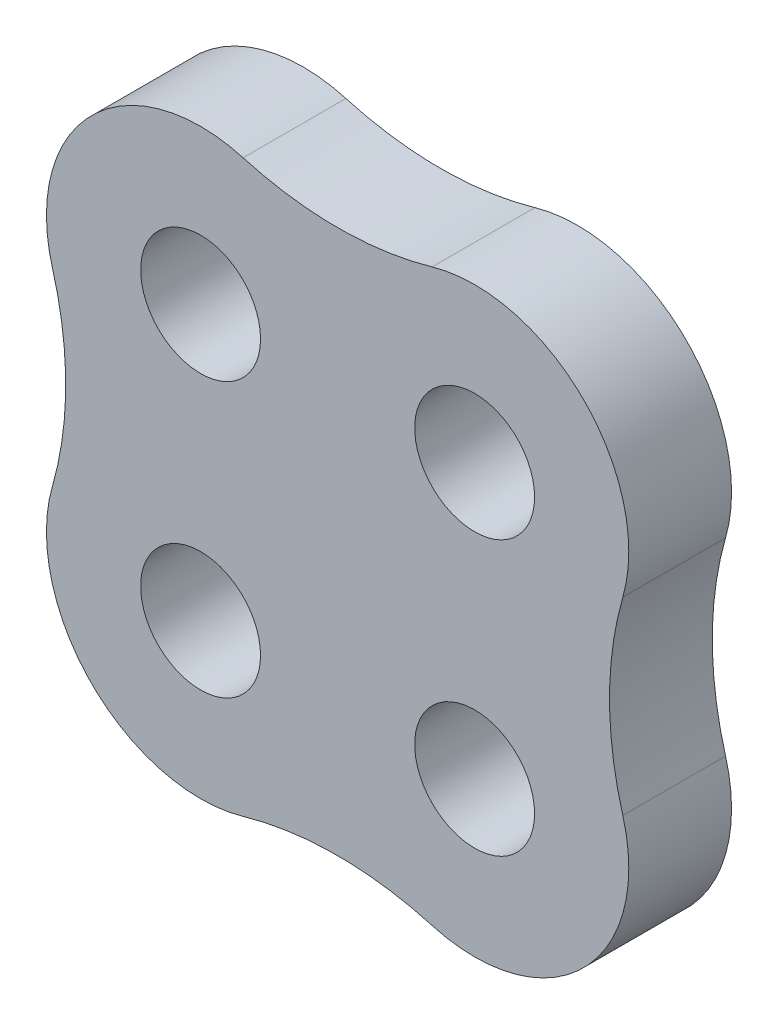
ISO-10303-21;
HEADER;
FILE_DESCRIPTION(('STEP AP214'),'2;1');
FILE_NAME('part.step','',(''),(''),'','','');
FILE_SCHEMA(('AUTOMOTIVE_DESIGN { 1 0 10303 214 1 1 1 1 }'));
ENDSEC;
DATA;
#1=APPLICATION_CONTEXT('core data for automotive mechanical design processes');
#2=APPLICATION_PROTOCOL_DEFINITION('international standard','automotive_design',2000,#1);
#3=PRODUCT_CONTEXT('',#1,'mechanical');
#4=PRODUCT('Part','Part','',(#3));
#5=PRODUCT_RELATED_PRODUCT_CATEGORY('part','',(#4));
#6=PRODUCT_DEFINITION_FORMATION('','',#4);
#7=PRODUCT_DEFINITION_CONTEXT('part definition',#1,'design');
#8=PRODUCT_DEFINITION('design','',#6,#7);
#9=PRODUCT_DEFINITION_SHAPE('','',#8);
#10=(LENGTH_UNIT() NAMED_UNIT(*) SI_UNIT(.MILLI.,.METRE.));
#11=(NAMED_UNIT(*) PLANE_ANGLE_UNIT() SI_UNIT($,.RADIAN.));
#12=(NAMED_UNIT(*) SI_UNIT($,.STERADIAN.) SOLID_ANGLE_UNIT());
#13=UNCERTAINTY_MEASURE_WITH_UNIT(LENGTH_MEASURE(1.E-05),#10,'distance_accuracy_value','');
#14=(GEOMETRIC_REPRESENTATION_CONTEXT(3) GLOBAL_UNCERTAINTY_ASSIGNED_CONTEXT((#13)) GLOBAL_UNIT_ASSIGNED_CONTEXT((#10,
#11,#12)) REPRESENTATION_CONTEXT('',''));
#15=CARTESIAN_POINT('',(0.,0.,0.));
#16=DIRECTION('',(0.,0.,1.));
#17=DIRECTION('',(1.,0.,0.));
#18=AXIS2_PLACEMENT_3D('',#15,#16,#17);
#19=CARTESIAN_POINT('',(7.99999999999997,8.,3.));
#20=DIRECTION('',(0.,0.,-1.));
#21=DIRECTION('',(-1.,0.,0.));
#22=AXIS2_PLACEMENT_3D('',#19,#20,#21);
#23=CYLINDRICAL_SURFACE('',#22,4.5);
#24=CARTESIAN_POINT('',(7.99999999999997,8.,3.));
#25=DIRECTION('',(0.,0.,1.));
#26=DIRECTION('',(1.,0.,0.));
#27=AXIS2_PLACEMENT_3D('',#24,#25,#26);
#28=CIRCLE('',#27,4.5);
#29=CARTESIAN_POINT('',(12.3253875442378,6.75862068965519,3.));
#30=VERTEX_POINT('',#29);
#31=CARTESIAN_POINT('',(6.75862068965514,12.3253875442378,3.));
#32=VERTEX_POINT('',#31);
#33=EDGE_CURVE('E122',#30,#32,#28,.T.);
#34=ORIENTED_EDGE('',*,*,#33,.F.);
#35=DIRECTION('',(0.,0.,-1.));
#36=VECTOR('',#35,1.);
#37=CARTESIAN_POINT('',(12.3253875442378,6.75862068965519,3.));
#38=LINE('',#37,#36);
#39=CARTESIAN_POINT('',(12.3253875442378,6.75862068965519,0.));
#40=VERTEX_POINT('',#39);
#41=EDGE_CURVE('E107',#30,#40,#38,.T.);
#42=ORIENTED_EDGE('',*,*,#41,.T.);
#43=CARTESIAN_POINT('',(7.99999999999997,8.,0.));
#44=DIRECTION('',(0.,0.,1.));
#45=DIRECTION('',(1.,0.,0.));
#46=AXIS2_PLACEMENT_3D('',#43,#44,#45);
#47=CIRCLE('',#46,4.5);
#48=CARTESIAN_POINT('',(6.75862068965514,12.3253875442378,0.));
#49=VERTEX_POINT('',#48);
#50=EDGE_CURVE('E119',#40,#49,#47,.T.);
#51=ORIENTED_EDGE('',*,*,#50,.T.);
#52=DIRECTION('',(0.,0.,-1.));
#53=VECTOR('',#52,1.);
#54=CARTESIAN_POINT('',(6.75862068965514,12.3253875442378,3.));
#55=LINE('',#54,#53);
#56=EDGE_CURVE('E124',#49,#32,#55,.F.);
#57=ORIENTED_EDGE('',*,*,#56,.T.);
#58=EDGE_LOOP('',(#34,#42,#51,#57));
#59=FACE_BOUND('',#58,.T.);
#60=ADVANCED_FACE('F37',(#59),#23,.T.);
#61=CARTESIAN_POINT('',(0.,8.,3.));
#62=DIRECTION('',(0.,0.,-1.));
#63=DIRECTION('',(-1.,0.,0.));
#64=AXIS2_PLACEMENT_3D('',#61,#62,#63);
#65=CYLINDRICAL_SURFACE('',#64,4.5);
#66=CARTESIAN_POINT('',(0.,8.,3.));
#67=DIRECTION('',(0.,0.,1.));
#68=DIRECTION('',(1.,0.,0.));
#69=AXIS2_PLACEMENT_3D('',#66,#67,#68);
#70=CIRCLE('',#69,4.5);
#71=CARTESIAN_POINT('',(1.2413793103448,12.3253875442378,3.));
#72=VERTEX_POINT('',#71);
#73=CARTESIAN_POINT('',(-4.32538754423786,6.75862068965516,3.));
#74=VERTEX_POINT('',#73);
#75=EDGE_CURVE('E191',#72,#74,#70,.T.);
#76=ORIENTED_EDGE('',*,*,#75,.F.);
#77=DIRECTION('',(0.,0.,-1.));
#78=VECTOR('',#77,1.);
#79=CARTESIAN_POINT('',(1.2413793103448,12.3253875442378,3.));
#80=LINE('',#79,#78);
#81=CARTESIAN_POINT('',(1.2413793103448,12.3253875442378,0.));
#82=VERTEX_POINT('',#81);
#83=EDGE_CURVE('E160',#72,#82,#80,.T.);
#84=ORIENTED_EDGE('',*,*,#83,.T.);
#85=CARTESIAN_POINT('',(0.,8.,0.));
#86=DIRECTION('',(0.,0.,1.));
#87=DIRECTION('',(1.,0.,0.));
#88=AXIS2_PLACEMENT_3D('',#85,#86,#87);
#89=CIRCLE('',#88,4.5);
#90=CARTESIAN_POINT('',(-4.32538754423786,6.75862068965516,0.));
#91=VERTEX_POINT('',#90);
#92=EDGE_CURVE('E130',#82,#91,#89,.T.);
#93=ORIENTED_EDGE('',*,*,#92,.T.);
#94=DIRECTION('',(0.,0.,-1.));
#95=VECTOR('',#94,1.);
#96=CARTESIAN_POINT('',(-4.32538754423786,6.75862068965516,3.));
#97=LINE('',#96,#95);
#98=EDGE_CURVE('E158',#91,#74,#97,.F.);
#99=ORIENTED_EDGE('',*,*,#98,.T.);
#100=EDGE_LOOP('',(#76,#84,#93,#99));
#101=FACE_BOUND('',#100,.T.);
#102=ADVANCED_FACE('F215',(#101),#65,.T.);
#103=CARTESIAN_POINT('',(0.,0.,3.));
#104=DIRECTION('',(0.,0.,-1.));
#105=DIRECTION('',(-1.,0.,0.));
#106=AXIS2_PLACEMENT_3D('',#103,#104,#105);
#107=CYLINDRICAL_SURFACE('',#106,4.5);
#108=CARTESIAN_POINT('',(0.,0.,3.));
#109=DIRECTION('',(0.,0.,1.));
#110=DIRECTION('',(1.,0.,0.));
#111=AXIS2_PLACEMENT_3D('',#108,#109,#110);
#112=CIRCLE('',#111,4.5);
#113=CARTESIAN_POINT('',(-4.32538754423784,1.24137931034481,3.));
#114=VERTEX_POINT('',#113);
#115=CARTESIAN_POINT('',(1.24137931034483,-4.32538754423783,3.));
#116=VERTEX_POINT('',#115);
#117=EDGE_CURVE('E183',#114,#116,#112,.T.);
#118=ORIENTED_EDGE('',*,*,#117,.F.);
#119=DIRECTION('',(0.,0.,-1.));
#120=VECTOR('',#119,1.);
#121=CARTESIAN_POINT('',(-4.32538754423784,1.24137931034481,3.));
#122=LINE('',#121,#120);
#123=CARTESIAN_POINT('',(-4.32538754423784,1.24137931034481,0.));
#124=VERTEX_POINT('',#123);
#125=EDGE_CURVE('E114',#114,#124,#122,.T.);
#126=ORIENTED_EDGE('',*,*,#125,.T.);
#127=CARTESIAN_POINT('',(0.,0.,0.));
#128=DIRECTION('',(0.,0.,1.));
#129=DIRECTION('',(1.,0.,0.));
#130=AXIS2_PLACEMENT_3D('',#127,#128,#129);
#131=CIRCLE('',#130,4.5);
#132=CARTESIAN_POINT('',(1.24137931034483,-4.32538754423783,0.));
#133=VERTEX_POINT('',#132);
#134=EDGE_CURVE('E133',#124,#133,#131,.T.);
#135=ORIENTED_EDGE('',*,*,#134,.T.);
#136=DIRECTION('',(0.,0.,-1.));
#137=VECTOR('',#136,1.);
#138=CARTESIAN_POINT('',(1.24137931034483,-4.32538754423783,3.));
#139=LINE('',#138,#137);
#140=EDGE_CURVE('E52',#133,#116,#139,.F.);
#141=ORIENTED_EDGE('',*,*,#140,.T.);
#142=EDGE_LOOP('',(#118,#126,#135,#141));
#143=FACE_BOUND('',#142,.T.);
#144=ADVANCED_FACE('F175',(#143),#107,.T.);
#145=CARTESIAN_POINT('',(0.,8.,3.));
#146=DIRECTION('',(0.,0.,-1.));
#147=DIRECTION('',(-1.,0.,0.));
#148=AXIS2_PLACEMENT_3D('',#145,#146,#147);
#149=CYLINDRICAL_SURFACE('',#148,1.75);
#150=CARTESIAN_POINT('',(0.,8.,3.));
#151=DIRECTION('',(0.,0.,1.));
#152=DIRECTION('',(1.,0.,0.));
#153=AXIS2_PLACEMENT_3D('',#150,#151,#152);
#154=CIRCLE('',#153,1.75);
#155=CARTESIAN_POINT('',(1.74999999999997,8.,3.));
#156=VERTEX_POINT('',#155);
#157=EDGE_CURVE('E196',#156,#156,#154,.T.);
#158=ORIENTED_EDGE('',*,*,#157,.T.);
#159=EDGE_LOOP('',(#158));
#160=FACE_BOUND('',#159,.T.);
#161=CARTESIAN_POINT('',(0.,8.,0.));
#162=DIRECTION('',(0.,0.,1.));
#163=DIRECTION('',(1.,0.,0.));
#164=AXIS2_PLACEMENT_3D('',#161,#162,#163);
#165=CIRCLE('',#164,1.75);
#166=CARTESIAN_POINT('',(1.74999999999997,8.,0.));
#167=VERTEX_POINT('',#166);
#168=EDGE_CURVE('E148',#167,#167,#165,.T.);
#169=ORIENTED_EDGE('',*,*,#168,.F.);
#170=EDGE_LOOP('',(#169));
#171=FACE_BOUND('',#170,.T.);
#172=ADVANCED_FACE('F293',(#160,#171),#149,.F.);
#173=CARTESIAN_POINT('',(0.,0.,3.));
#174=DIRECTION('',(0.,0.,-1.));
#175=DIRECTION('',(-1.,0.,0.));
#176=AXIS2_PLACEMENT_3D('',#173,#174,#175);
#177=CYLINDRICAL_SURFACE('',#176,1.75);
#178=CARTESIAN_POINT('',(0.,0.,3.));
#179=DIRECTION('',(0.,0.,1.));
#180=DIRECTION('',(1.,0.,0.));
#181=AXIS2_PLACEMENT_3D('',#178,#179,#180);
#182=CIRCLE('',#181,1.75);
#183=CARTESIAN_POINT('',(1.75,0.,3.));
#184=VERTEX_POINT('',#183);
#185=EDGE_CURVE('E189',#184,#184,#182,.T.);
#186=ORIENTED_EDGE('',*,*,#185,.T.);
#187=EDGE_LOOP('',(#186));
#188=FACE_BOUND('',#187,.T.);
#189=CARTESIAN_POINT('',(0.,0.,0.));
#190=DIRECTION('',(0.,0.,1.));
#191=DIRECTION('',(1.,0.,0.));
#192=AXIS2_PLACEMENT_3D('',#189,#190,#191);
#193=CIRCLE('',#192,1.75);
#194=CARTESIAN_POINT('',(1.75,0.,0.));
#195=VERTEX_POINT('',#194);
#196=EDGE_CURVE('E145',#195,#195,#193,.T.);
#197=ORIENTED_EDGE('',*,*,#196,.F.);
#198=EDGE_LOOP('',(#197));
#199=FACE_BOUND('',#198,.T.);
#200=ADVANCED_FACE('F317',(#188,#199),#177,.F.);
#201=CARTESIAN_POINT('',(8.,0.,3.));
#202=DIRECTION('',(0.,0.,-1.));
#203=DIRECTION('',(-1.,0.,0.));
#204=AXIS2_PLACEMENT_3D('',#201,#202,#203);
#205=CYLINDRICAL_SURFACE('',#204,1.75);
#206=CARTESIAN_POINT('',(8.,0.,3.));
#207=DIRECTION('',(0.,0.,1.));
#208=DIRECTION('',(1.,0.,0.));
#209=AXIS2_PLACEMENT_3D('',#206,#207,#208);
#210=CIRCLE('',#209,1.75);
#211=CARTESIAN_POINT('',(9.75,0.,3.));
#212=VERTEX_POINT('',#211);
#213=EDGE_CURVE('E186',#212,#212,#210,.T.);
#214=ORIENTED_EDGE('',*,*,#213,.T.);
#215=EDGE_LOOP('',(#214));
#216=FACE_BOUND('',#215,.T.);
#217=CARTESIAN_POINT('',(8.,0.,0.));
#218=DIRECTION('',(0.,0.,1.));
#219=DIRECTION('',(1.,0.,0.));
#220=AXIS2_PLACEMENT_3D('',#217,#218,#219);
#221=CIRCLE('',#220,1.75);
#222=CARTESIAN_POINT('',(9.75,0.,0.));
#223=VERTEX_POINT('',#222);
#224=EDGE_CURVE('E142',#223,#223,#221,.T.);
#225=ORIENTED_EDGE('',*,*,#224,.F.);
#226=EDGE_LOOP('',(#225));
#227=FACE_BOUND('',#226,.T.);
#228=ADVANCED_FACE('F281',(#216,#227),#205,.F.);
#229=CARTESIAN_POINT('',(8.,0.,3.));
#230=DIRECTION('',(0.,0.,-1.));
#231=DIRECTION('',(-1.,0.,0.));
#232=AXIS2_PLACEMENT_3D('',#229,#230,#231);
#233=CYLINDRICAL_SURFACE('',#232,4.5);
#234=CARTESIAN_POINT('',(8.,0.,0.));
#235=DIRECTION('',(0.,0.,1.));
#236=DIRECTION('',(1.,0.,0.));
#237=AXIS2_PLACEMENT_3D('',#234,#235,#236);
#238=CIRCLE('',#237,4.5);
#239=CARTESIAN_POINT('',(6.75862068965517,-4.32538754423784,0.));
#240=VERTEX_POINT('',#239);
#241=CARTESIAN_POINT('',(12.3253875442378,1.24137931034484,0.));
#242=VERTEX_POINT('',#241);
#243=EDGE_CURVE('E140',#240,#242,#238,.T.);
#244=ORIENTED_EDGE('',*,*,#243,.T.);
#245=DIRECTION('',(0.,0.,-1.));
#246=VECTOR('',#245,1.);
#247=CARTESIAN_POINT('',(12.3253875442378,1.24137931034484,3.));
#248=LINE('',#247,#246);
#249=CARTESIAN_POINT('',(12.3253875442378,1.24137931034484,3.));
#250=VERTEX_POINT('',#249);
#251=EDGE_CURVE('E108',#242,#250,#248,.F.);
#252=ORIENTED_EDGE('',*,*,#251,.T.);
#253=CARTESIAN_POINT('',(8.,0.,3.));
#254=DIRECTION('',(0.,0.,1.));
#255=DIRECTION('',(1.,0.,0.));
#256=AXIS2_PLACEMENT_3D('',#253,#254,#255);
#257=CIRCLE('',#256,4.5);
#258=CARTESIAN_POINT('',(6.75862068965517,-4.32538754423784,3.));
#259=VERTEX_POINT('',#258);
#260=EDGE_CURVE('E182',#259,#250,#257,.T.);
#261=ORIENTED_EDGE('',*,*,#260,.F.);
#262=DIRECTION('',(0.,0.,-1.));
#263=VECTOR('',#262,1.);
#264=CARTESIAN_POINT('',(6.75862068965517,-4.32538754423783,3.));
#265=LINE('',#264,#263);
#266=EDGE_CURVE('E123',#259,#240,#265,.T.);
#267=ORIENTED_EDGE('',*,*,#266,.T.);
#268=EDGE_LOOP('',(#244,#252,#261,#267));
#269=FACE_BOUND('',#268,.T.);
#270=ADVANCED_FACE('F185',(#269),#233,.T.);
#271=CARTESIAN_POINT('',(7.99999999999997,8.,3.));
#272=DIRECTION('',(0.,0.,-1.));
#273=DIRECTION('',(-1.,0.,0.));
#274=AXIS2_PLACEMENT_3D('',#271,#272,#273);
#275=CYLINDRICAL_SURFACE('',#274,1.75);
#276=CARTESIAN_POINT('',(7.99999999999997,8.,3.));
#277=DIRECTION('',(0.,0.,1.));
#278=DIRECTION('',(1.,0.,0.));
#279=AXIS2_PLACEMENT_3D('',#276,#277,#278);
#280=CIRCLE('',#279,1.75);
#281=CARTESIAN_POINT('',(9.74999999999997,8.,3.));
#282=VERTEX_POINT('',#281);
#283=EDGE_CURVE('E136',#282,#282,#280,.T.);
#284=ORIENTED_EDGE('',*,*,#283,.T.);
#285=EDGE_LOOP('',(#284));
#286=FACE_BOUND('',#285,.T.);
#287=CARTESIAN_POINT('',(7.99999999999997,8.,0.));
#288=DIRECTION('',(0.,0.,1.));
#289=DIRECTION('',(1.,0.,0.));
#290=AXIS2_PLACEMENT_3D('',#287,#288,#289);
#291=CIRCLE('',#290,1.75);
#292=CARTESIAN_POINT('',(9.74999999999997,8.,0.));
#293=VERTEX_POINT('',#292);
#294=EDGE_CURVE('E151',#293,#293,#291,.T.);
#295=ORIENTED_EDGE('',*,*,#294,.F.);
#296=EDGE_LOOP('',(#295));
#297=FACE_BOUND('',#296,.T.);
#298=ADVANCED_FACE('F203',(#286,#297),#275,.F.);
#299=CARTESIAN_POINT('',(0.,0.,3.));
#300=DIRECTION('',(0.,0.,1.));
#301=DIRECTION('',(1.,0.,0.));
#302=AXIS2_PLACEMENT_3D('',#299,#300,#301);
#303=PLANE('',#302);
#304=ORIENTED_EDGE('',*,*,#260,.T.);
#305=CARTESIAN_POINT('',(21.9373598647663,4.00000000000005,3.));
#306=DIRECTION('',(0.,0.,1.));
#307=DIRECTION('',(1.,0.,0.));
#308=AXIS2_PLACEMENT_3D('',#305,#306,#307);
#309=CIRCLE('',#308,10.);
#310=EDGE_CURVE('E113',#250,#30,#309,.F.);
#311=ORIENTED_EDGE('',*,*,#310,.T.);
#312=ORIENTED_EDGE('',*,*,#33,.T.);
#313=CARTESIAN_POINT('',(3.99999999999997,21.9373598647664,3.));
#314=DIRECTION('',(0.,0.,1.));
#315=DIRECTION('',(1.,0.,0.));
#316=AXIS2_PLACEMENT_3D('',#313,#314,#315);
#317=CIRCLE('',#316,10.);
#318=EDGE_CURVE('E168',#32,#72,#317,.F.);
#319=ORIENTED_EDGE('',*,*,#318,.T.);
#320=ORIENTED_EDGE('',*,*,#75,.T.);
#321=CARTESIAN_POINT('',(-13.9373598647664,3.99999999999995,3.));
#322=DIRECTION('',(0.,0.,1.));
#323=DIRECTION('',(1.,0.,0.));
#324=AXIS2_PLACEMENT_3D('',#321,#322,#323);
#325=CIRCLE('',#324,10.);
#326=EDGE_CURVE('E59',#74,#114,#325,.F.);
#327=ORIENTED_EDGE('',*,*,#326,.T.);
#328=ORIENTED_EDGE('',*,*,#117,.T.);
#329=CARTESIAN_POINT('',(3.99999999999999,-13.9373598647664,3.));
#330=DIRECTION('',(0.,0.,1.));
#331=DIRECTION('',(1.,0.,0.));
#332=AXIS2_PLACEMENT_3D('',#329,#330,#331);
#333=CIRCLE('',#332,10.);
#334=EDGE_CURVE('E11',#116,#259,#333,.F.);
#335=ORIENTED_EDGE('',*,*,#334,.T.);
#336=EDGE_LOOP('',(#304,#311,#312,#319,#320,#327,#328,#335));
#337=FACE_BOUND('',#336,.T.);
#338=ORIENTED_EDGE('',*,*,#213,.F.);
#339=EDGE_LOOP('',(#338));
#340=FACE_BOUND('',#339,.T.);
#341=ORIENTED_EDGE('',*,*,#185,.F.);
#342=EDGE_LOOP('',(#341));
#343=FACE_BOUND('',#342,.T.);
#344=ORIENTED_EDGE('',*,*,#157,.F.);
#345=EDGE_LOOP('',(#344));
#346=FACE_BOUND('',#345,.T.);
#347=ORIENTED_EDGE('',*,*,#283,.F.);
#348=EDGE_LOOP('',(#347));
#349=FACE_BOUND('',#348,.T.);
#350=ADVANCED_FACE('F180',(#337,#340,#343,#346,#349),#303,.T.);
#351=CARTESIAN_POINT('',(0.,0.,0.));
#352=DIRECTION('',(0.,0.,1.));
#353=DIRECTION('',(1.,0.,0.));
#354=AXIS2_PLACEMENT_3D('',#351,#352,#353);
#355=PLANE('',#354);
#356=ORIENTED_EDGE('',*,*,#50,.F.);
#357=CARTESIAN_POINT('',(21.9373598647663,4.00000000000005,0.));
#358=DIRECTION('',(0.,0.,1.));
#359=DIRECTION('',(1.,0.,0.));
#360=AXIS2_PLACEMENT_3D('',#357,#358,#359);
#361=CIRCLE('',#360,10.);
#362=EDGE_CURVE('E103',#40,#242,#361,.T.);
#363=ORIENTED_EDGE('',*,*,#362,.T.);
#364=ORIENTED_EDGE('',*,*,#243,.F.);
#365=CARTESIAN_POINT('',(3.99999999999999,-13.9373598647664,0.));
#366=DIRECTION('',(0.,0.,1.));
#367=DIRECTION('',(1.,0.,0.));
#368=AXIS2_PLACEMENT_3D('',#365,#366,#367);
#369=CIRCLE('',#368,10.);
#370=EDGE_CURVE('E45',#240,#133,#369,.T.);
#371=ORIENTED_EDGE('',*,*,#370,.T.);
#372=ORIENTED_EDGE('',*,*,#134,.F.);
#373=CARTESIAN_POINT('',(-13.9373598647664,3.99999999999995,0.));
#374=DIRECTION('',(0.,0.,1.));
#375=DIRECTION('',(1.,0.,0.));
#376=AXIS2_PLACEMENT_3D('',#373,#374,#375);
#377=CIRCLE('',#376,10.);
#378=EDGE_CURVE('E170',#124,#91,#377,.T.);
#379=ORIENTED_EDGE('',*,*,#378,.T.);
#380=ORIENTED_EDGE('',*,*,#92,.F.);
#381=CARTESIAN_POINT('',(3.99999999999997,21.9373598647664,0.));
#382=DIRECTION('',(0.,0.,1.));
#383=DIRECTION('',(1.,0.,0.));
#384=AXIS2_PLACEMENT_3D('',#381,#382,#383);
#385=CIRCLE('',#384,10.);
#386=EDGE_CURVE('E129',#82,#49,#385,.T.);
#387=ORIENTED_EDGE('',*,*,#386,.T.);
#388=EDGE_LOOP('',(#356,#363,#364,#371,#372,#379,#380,#387));
#389=FACE_BOUND('',#388,.T.);
#390=ORIENTED_EDGE('',*,*,#224,.T.);
#391=EDGE_LOOP('',(#390));
#392=FACE_BOUND('',#391,.T.);
#393=ORIENTED_EDGE('',*,*,#196,.T.);
#394=EDGE_LOOP('',(#393));
#395=FACE_BOUND('',#394,.T.);
#396=ORIENTED_EDGE('',*,*,#168,.T.);
#397=EDGE_LOOP('',(#396));
#398=FACE_BOUND('',#397,.T.);
#399=ORIENTED_EDGE('',*,*,#294,.T.);
#400=EDGE_LOOP('',(#399));
#401=FACE_BOUND('',#400,.T.);
#402=ADVANCED_FACE('F126',(#389,#392,#395,#398,#401),#355,.F.);
#403=CARTESIAN_POINT('',(21.9373598647663,4.00000000000005,3.));
#404=DIRECTION('',(0.,0.,1.));
#405=DIRECTION('',(1.,0.,0.));
#406=AXIS2_PLACEMENT_3D('',#403,#404,#405);
#407=CYLINDRICAL_SURFACE('',#406,10.);
#408=ORIENTED_EDGE('',*,*,#310,.F.);
#409=ORIENTED_EDGE('',*,*,#251,.F.);
#410=ORIENTED_EDGE('',*,*,#362,.F.);
#411=ORIENTED_EDGE('',*,*,#41,.F.);
#412=EDGE_LOOP('',(#408,#409,#410,#411));
#413=FACE_BOUND('',#412,.T.);
#414=ADVANCED_FACE('F106',(#413),#407,.F.);
#415=CARTESIAN_POINT('',(3.99999999999997,21.9373598647664,3.));
#416=DIRECTION('',(0.,0.,1.));
#417=DIRECTION('',(1.,0.,0.));
#418=AXIS2_PLACEMENT_3D('',#415,#416,#417);
#419=CYLINDRICAL_SURFACE('',#418,10.);
#420=ORIENTED_EDGE('',*,*,#318,.F.);
#421=ORIENTED_EDGE('',*,*,#56,.F.);
#422=ORIENTED_EDGE('',*,*,#386,.F.);
#423=ORIENTED_EDGE('',*,*,#83,.F.);
#424=EDGE_LOOP('',(#420,#421,#422,#423));
#425=FACE_BOUND('',#424,.T.);
#426=ADVANCED_FACE('F226',(#425),#419,.F.);
#427=CARTESIAN_POINT('',(-13.9373598647664,3.99999999999995,3.));
#428=DIRECTION('',(0.,0.,1.));
#429=DIRECTION('',(1.,0.,0.));
#430=AXIS2_PLACEMENT_3D('',#427,#428,#429);
#431=CYLINDRICAL_SURFACE('',#430,10.);
#432=ORIENTED_EDGE('',*,*,#326,.F.);
#433=ORIENTED_EDGE('',*,*,#98,.F.);
#434=ORIENTED_EDGE('',*,*,#378,.F.);
#435=ORIENTED_EDGE('',*,*,#125,.F.);
#436=EDGE_LOOP('',(#432,#433,#434,#435));
#437=FACE_BOUND('',#436,.T.);
#438=ADVANCED_FACE('F228',(#437),#431,.F.);
#439=CARTESIAN_POINT('',(3.99999999999999,-13.9373598647664,3.));
#440=DIRECTION('',(0.,0.,1.));
#441=DIRECTION('',(1.,0.,0.));
#442=AXIS2_PLACEMENT_3D('',#439,#440,#441);
#443=CYLINDRICAL_SURFACE('',#442,10.);
#444=ORIENTED_EDGE('',*,*,#334,.F.);
#445=ORIENTED_EDGE('',*,*,#140,.F.);
#446=ORIENTED_EDGE('',*,*,#370,.F.);
#447=ORIENTED_EDGE('',*,*,#266,.F.);
#448=EDGE_LOOP('',(#444,#445,#446,#447));
#449=FACE_BOUND('',#448,.T.);
#450=ADVANCED_FACE('F39',(#449),#443,.F.);
#451=CLOSED_SHELL('',(#60,#102,#144,#172,#200,#228,#270,#298,#350,#402,#414,#426,#438,#450));
#452=MANIFOLD_SOLID_BREP('B2',#451);
#453=ADVANCED_BREP_SHAPE_REPRESENTATION('',(#18,#452),#14);
#454=SHAPE_DEFINITION_REPRESENTATION(#9,#453);
ENDSEC;
END-ISO-10303-21;
